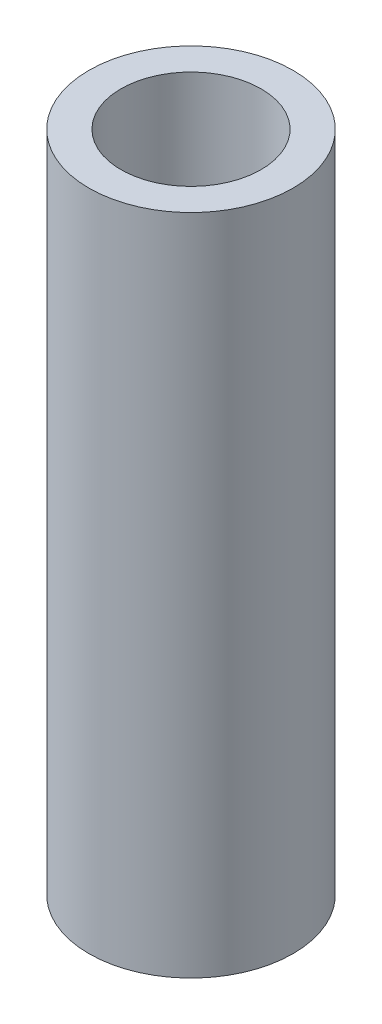
ISO-10303-21;
HEADER;
FILE_DESCRIPTION(('STEP AP214'),'2;1');
FILE_NAME('part.step','',(''),(''),'','','');
FILE_SCHEMA(('AUTOMOTIVE_DESIGN { 1 0 10303 214 1 1 1 1 }'));
ENDSEC;
DATA;
#1=APPLICATION_CONTEXT('core data for automotive mechanical design processes');
#2=APPLICATION_PROTOCOL_DEFINITION('international standard','automotive_design',2000,#1);
#3=PRODUCT_CONTEXT('',#1,'mechanical');
#4=PRODUCT('Part','Part','',(#3));
#5=PRODUCT_RELATED_PRODUCT_CATEGORY('part','',(#4));
#6=PRODUCT_DEFINITION_FORMATION('','',#4);
#7=PRODUCT_DEFINITION_CONTEXT('part definition',#1,'design');
#8=PRODUCT_DEFINITION('design','',#6,#7);
#9=PRODUCT_DEFINITION_SHAPE('','',#8);
#10=(LENGTH_UNIT() NAMED_UNIT(*) SI_UNIT(.MILLI.,.METRE.));
#11=(NAMED_UNIT(*) PLANE_ANGLE_UNIT() SI_UNIT($,.RADIAN.));
#12=(NAMED_UNIT(*) SI_UNIT($,.STERADIAN.) SOLID_ANGLE_UNIT());
#13=UNCERTAINTY_MEASURE_WITH_UNIT(LENGTH_MEASURE(1.E-05),#10,'distance_accuracy_value','');
#14=(GEOMETRIC_REPRESENTATION_CONTEXT(3) GLOBAL_UNCERTAINTY_ASSIGNED_CONTEXT((#13)) GLOBAL_UNIT_ASSIGNED_CONTEXT((#10,
#11,#12)) REPRESENTATION_CONTEXT('',''));
#15=CARTESIAN_POINT('',(0.,0.,0.));
#16=DIRECTION('',(0.,0.,1.));
#17=DIRECTION('',(1.,0.,0.));
#18=AXIS2_PLACEMENT_3D('',#15,#16,#17);
#19=CARTESIAN_POINT('',(0.,57.,0.));
#20=DIRECTION('',(0.,1.,0.));
#21=DIRECTION('',(0.,0.,1.));
#22=AXIS2_PLACEMENT_3D('',#19,#20,#21);
#23=PLANE('',#22);
#24=CARTESIAN_POINT('',(0.,57.,0.));
#25=DIRECTION('',(0.,1.,0.));
#26=DIRECTION('',(1.,0.,0.));
#27=AXIS2_PLACEMENT_3D('',#24,#25,#26);
#28=CIRCLE('',#27,8.775);
#29=CARTESIAN_POINT('',(0.,57.,-8.775));
#30=VERTEX_POINT('',#29);
#31=EDGE_CURVE('E11',#30,#30,#28,.T.);
#32=ORIENTED_EDGE('',*,*,#31,.T.);
#33=EDGE_LOOP('',(#32));
#34=FACE_BOUND('',#33,.T.);
#35=CARTESIAN_POINT('',(0.,57.,0.));
#36=DIRECTION('',(0.,1.,0.));
#37=DIRECTION('',(0.,0.,1.));
#38=AXIS2_PLACEMENT_3D('',#35,#36,#37);
#39=CIRCLE('',#38,6.025);
#40=CARTESIAN_POINT('',(0.,57.,-6.025));
#41=VERTEX_POINT('',#40);
#42=EDGE_CURVE('E62',#41,#41,#39,.T.);
#43=ORIENTED_EDGE('',*,*,#42,.F.);
#44=EDGE_LOOP('',(#43));
#45=FACE_BOUND('',#44,.T.);
#46=ADVANCED_FACE('F49',(#34,#45),#23,.T.);
#47=CARTESIAN_POINT('',(0.,0.,0.));
#48=DIRECTION('',(0.,1.,0.));
#49=DIRECTION('',(0.,0.,1.));
#50=AXIS2_PLACEMENT_3D('',#47,#48,#49);
#51=PLANE('',#50);
#52=CARTESIAN_POINT('',(0.,0.,0.));
#53=DIRECTION('',(0.,1.,0.));
#54=DIRECTION('',(1.,0.,0.));
#55=AXIS2_PLACEMENT_3D('',#52,#53,#54);
#56=CIRCLE('',#55,8.775);
#57=CARTESIAN_POINT('',(0.,0.,-8.775));
#58=VERTEX_POINT('',#57);
#59=EDGE_CURVE('E53',#58,#58,#56,.T.);
#60=ORIENTED_EDGE('',*,*,#59,.F.);
#61=EDGE_LOOP('',(#60));
#62=FACE_BOUND('',#61,.T.);
#63=CARTESIAN_POINT('',(0.,0.,0.));
#64=DIRECTION('',(0.,1.,0.));
#65=DIRECTION('',(0.,0.,1.));
#66=AXIS2_PLACEMENT_3D('',#63,#64,#65);
#67=CIRCLE('',#66,6.025);
#68=CARTESIAN_POINT('',(0.,0.,-6.025));
#69=VERTEX_POINT('',#68);
#70=EDGE_CURVE('E64',#69,#69,#67,.T.);
#71=ORIENTED_EDGE('',*,*,#70,.T.);
#72=EDGE_LOOP('',(#71));
#73=FACE_BOUND('',#72,.T.);
#74=ADVANCED_FACE('F76',(#62,#73),#51,.F.);
#75=CARTESIAN_POINT('',(0.,57.,0.));
#76=DIRECTION('',(0.,-1.,0.));
#77=DIRECTION('',(0.,0.,-1.));
#78=AXIS2_PLACEMENT_3D('',#75,#76,#77);
#79=CYLINDRICAL_SURFACE('',#78,8.775);
#80=CARTESIAN_POINT('',(0.,57.,-8.775));
#81=CARTESIAN_POINT('',(0.,56.40625,-8.775));
#82=CARTESIAN_POINT('',(0.,55.8125,-8.775));
#83=CARTESIAN_POINT('',(0.,54.625,-8.775));
#84=CARTESIAN_POINT('',(0.,54.03125,-8.775));
#85=CARTESIAN_POINT('',(0.,52.84375,-8.775));
#86=CARTESIAN_POINT('',(0.,52.25,-8.775));
#87=CARTESIAN_POINT('',(0.,51.0625,-8.775));
#88=CARTESIAN_POINT('',(0.,50.46875,-8.775));
#89=CARTESIAN_POINT('',(0.,49.28125,-8.775));
#90=CARTESIAN_POINT('',(0.,48.6875,-8.775));
#91=CARTESIAN_POINT('',(0.,47.5,-8.775));
#92=CARTESIAN_POINT('',(0.,46.90625,-8.775));
#93=CARTESIAN_POINT('',(0.,45.71875,-8.775));
#94=CARTESIAN_POINT('',(0.,45.125,-8.775));
#95=CARTESIAN_POINT('',(0.,43.9375,-8.775));
#96=CARTESIAN_POINT('',(0.,43.34375,-8.775));
#97=CARTESIAN_POINT('',(0.,42.15625,-8.775));
#98=CARTESIAN_POINT('',(0.,41.5625,-8.775));
#99=CARTESIAN_POINT('',(0.,40.375,-8.775));
#100=CARTESIAN_POINT('',(0.,39.78125,-8.775));
#101=CARTESIAN_POINT('',(0.,38.59375,-8.775));
#102=CARTESIAN_POINT('',(0.,38.,-8.775));
#103=CARTESIAN_POINT('',(0.,36.8125,-8.775));
#104=CARTESIAN_POINT('',(0.,36.21875,-8.775));
#105=CARTESIAN_POINT('',(0.,35.03125,-8.775));
#106=CARTESIAN_POINT('',(0.,34.4375,-8.775));
#107=CARTESIAN_POINT('',(0.,33.25,-8.775));
#108=CARTESIAN_POINT('',(0.,32.65625,-8.775));
#109=CARTESIAN_POINT('',(0.,31.46875,-8.775));
#110=CARTESIAN_POINT('',(0.,30.875,-8.775));
#111=CARTESIAN_POINT('',(0.,29.6875,-8.775));
#112=CARTESIAN_POINT('',(0.,29.09375,-8.775));
#113=CARTESIAN_POINT('',(0.,27.90625,-8.775));
#114=CARTESIAN_POINT('',(0.,27.3125,-8.775));
#115=CARTESIAN_POINT('',(0.,26.125,-8.775));
#116=CARTESIAN_POINT('',(0.,25.53125,-8.775));
#117=CARTESIAN_POINT('',(0.,24.34375,-8.775));
#118=CARTESIAN_POINT('',(0.,23.75,-8.775));
#119=CARTESIAN_POINT('',(0.,22.5625,-8.775));
#120=CARTESIAN_POINT('',(0.,21.96875,-8.775));
#121=CARTESIAN_POINT('',(0.,20.78125,-8.775));
#122=CARTESIAN_POINT('',(0.,20.1875,-8.775));
#123=CARTESIAN_POINT('',(0.,19.,-8.775));
#124=CARTESIAN_POINT('',(0.,18.40625,-8.775));
#125=CARTESIAN_POINT('',(0.,17.21875,-8.775));
#126=CARTESIAN_POINT('',(0.,16.625,-8.775));
#127=CARTESIAN_POINT('',(0.,15.4375,-8.775));
#128=CARTESIAN_POINT('',(0.,14.84375,-8.775));
#129=CARTESIAN_POINT('',(0.,13.65625,-8.775));
#130=CARTESIAN_POINT('',(0.,13.0625,-8.775));
#131=CARTESIAN_POINT('',(0.,11.875,-8.775));
#132=CARTESIAN_POINT('',(0.,11.28125,-8.775));
#133=CARTESIAN_POINT('',(0.,10.09375,-8.775));
#134=CARTESIAN_POINT('',(0.,9.5,-8.775));
#135=CARTESIAN_POINT('',(0.,8.3125,-8.775));
#136=CARTESIAN_POINT('',(0.,7.71875,-8.775));
#137=CARTESIAN_POINT('',(0.,6.53125,-8.775));
#138=CARTESIAN_POINT('',(0.,5.9375,-8.775));
#139=CARTESIAN_POINT('',(0.,4.75,-8.775));
#140=CARTESIAN_POINT('',(0.,4.15625,-8.775));
#141=CARTESIAN_POINT('',(0.,2.96875,-8.775));
#142=CARTESIAN_POINT('',(0.,2.375,-8.775));
#143=CARTESIAN_POINT('',(0.,1.1875,-8.775));
#144=CARTESIAN_POINT('',(0.,0.593749999999999,-8.775));
#145=CARTESIAN_POINT('',(0.,0.,-8.775));
#146=B_SPLINE_CURVE_WITH_KNOTS('',3,(#80,#81,#82,#83,#84,#85,#86,#87,#88,#89,#90,#91,#92,#93,
#94,#95,#96,#97,#98,#99,#100,#101,#102,#103,#104,#105,#106,#107,#108,#109,#110,#111,#112,#113,
#114,#115,#116,#117,#118,#119,#120,#121,#122,#123,#124,#125,#126,#127,#128,#129,#130,#131,#132,
#133,#134,#135,#136,#137,#138,#139,#140,#141,#142,#143,#144,#145),.UNSPECIFIED.,.F.,.F.,(4,2,2,
2,2,2,2,2,2,2,2,2,2,2,2,2,2,2,2,2,2,2,2,2,2,2,2,2,2,2,2,2,4),(0.,1.78125000000001,3.5625,
5.34375,7.12500000000001,8.90625,10.6875,12.46875,14.25,16.03125,17.8125,19.59375,21.375,
23.15625,24.9375,26.71875,28.5,30.28125,32.0625,33.84375,35.625,37.40625,39.1875,40.96875,42.75,
44.53125,46.3125,48.09375,49.875,51.65625,53.4375,55.21875,57.),.UNSPECIFIED.);
#147=EDGE_CURVE('BSEAM51',#30,#58,#146,.T.);
#148=ORIENTED_EDGE('',*,*,#31,.F.);
#149=ORIENTED_EDGE('',*,*,#59,.T.);
#150=ORIENTED_EDGE('',*,*,#147,.T.);
#151=ORIENTED_EDGE('',*,*,#147,.F.);
#152=EDGE_LOOP('',(#148,#150,#149,#151));
#153=FACE_BOUND('',#152,.T.);
#154=ADVANCED_FACE('F51',(#153),#79,.T.);
#155=CARTESIAN_POINT('',(0.,57.,0.));
#156=DIRECTION('',(0.,-1.,0.));
#157=DIRECTION('',(0.,0.,-1.));
#158=AXIS2_PLACEMENT_3D('',#155,#156,#157);
#159=CYLINDRICAL_SURFACE('',#158,6.025);
#160=CARTESIAN_POINT('',(0.,57.,-6.025));
#161=CARTESIAN_POINT('',(0.,56.40625,-6.025));
#162=CARTESIAN_POINT('',(0.,55.8125,-6.025));
#163=CARTESIAN_POINT('',(0.,54.625,-6.025));
#164=CARTESIAN_POINT('',(0.,54.03125,-6.025));
#165=CARTESIAN_POINT('',(0.,52.84375,-6.025));
#166=CARTESIAN_POINT('',(0.,52.25,-6.025));
#167=CARTESIAN_POINT('',(0.,51.0625,-6.025));
#168=CARTESIAN_POINT('',(0.,50.46875,-6.025));
#169=CARTESIAN_POINT('',(0.,49.28125,-6.025));
#170=CARTESIAN_POINT('',(0.,48.6875,-6.025));
#171=CARTESIAN_POINT('',(0.,47.5,-6.025));
#172=CARTESIAN_POINT('',(0.,46.90625,-6.025));
#173=CARTESIAN_POINT('',(0.,45.71875,-6.025));
#174=CARTESIAN_POINT('',(0.,45.125,-6.025));
#175=CARTESIAN_POINT('',(0.,43.9375,-6.025));
#176=CARTESIAN_POINT('',(0.,43.34375,-6.025));
#177=CARTESIAN_POINT('',(0.,42.15625,-6.025));
#178=CARTESIAN_POINT('',(0.,41.5625,-6.025));
#179=CARTESIAN_POINT('',(0.,40.375,-6.025));
#180=CARTESIAN_POINT('',(0.,39.78125,-6.025));
#181=CARTESIAN_POINT('',(0.,38.59375,-6.025));
#182=CARTESIAN_POINT('',(0.,38.,-6.025));
#183=CARTESIAN_POINT('',(0.,36.8125,-6.025));
#184=CARTESIAN_POINT('',(0.,36.21875,-6.025));
#185=CARTESIAN_POINT('',(0.,35.03125,-6.025));
#186=CARTESIAN_POINT('',(0.,34.4375,-6.025));
#187=CARTESIAN_POINT('',(0.,33.25,-6.025));
#188=CARTESIAN_POINT('',(0.,32.65625,-6.025));
#189=CARTESIAN_POINT('',(0.,31.46875,-6.025));
#190=CARTESIAN_POINT('',(0.,30.875,-6.025));
#191=CARTESIAN_POINT('',(0.,29.6875,-6.025));
#192=CARTESIAN_POINT('',(0.,29.09375,-6.025));
#193=CARTESIAN_POINT('',(0.,27.90625,-6.025));
#194=CARTESIAN_POINT('',(0.,27.3125,-6.025));
#195=CARTESIAN_POINT('',(0.,26.125,-6.025));
#196=CARTESIAN_POINT('',(0.,25.53125,-6.025));
#197=CARTESIAN_POINT('',(0.,24.34375,-6.025));
#198=CARTESIAN_POINT('',(0.,23.75,-6.025));
#199=CARTESIAN_POINT('',(0.,22.5625,-6.025));
#200=CARTESIAN_POINT('',(0.,21.96875,-6.025));
#201=CARTESIAN_POINT('',(0.,20.78125,-6.025));
#202=CARTESIAN_POINT('',(0.,20.1875,-6.025));
#203=CARTESIAN_POINT('',(0.,19.,-6.025));
#204=CARTESIAN_POINT('',(0.,18.40625,-6.025));
#205=CARTESIAN_POINT('',(0.,17.21875,-6.025));
#206=CARTESIAN_POINT('',(0.,16.625,-6.025));
#207=CARTESIAN_POINT('',(0.,15.4375,-6.025));
#208=CARTESIAN_POINT('',(0.,14.84375,-6.025));
#209=CARTESIAN_POINT('',(0.,13.65625,-6.025));
#210=CARTESIAN_POINT('',(0.,13.0625,-6.025));
#211=CARTESIAN_POINT('',(0.,11.875,-6.025));
#212=CARTESIAN_POINT('',(0.,11.28125,-6.025));
#213=CARTESIAN_POINT('',(0.,10.09375,-6.025));
#214=CARTESIAN_POINT('',(0.,9.5,-6.025));
#215=CARTESIAN_POINT('',(0.,8.3125,-6.025));
#216=CARTESIAN_POINT('',(0.,7.71875,-6.025));
#217=CARTESIAN_POINT('',(0.,6.53125,-6.025));
#218=CARTESIAN_POINT('',(0.,5.9375,-6.025));
#219=CARTESIAN_POINT('',(0.,4.75,-6.025));
#220=CARTESIAN_POINT('',(0.,4.15625,-6.025));
#221=CARTESIAN_POINT('',(0.,2.96875,-6.025));
#222=CARTESIAN_POINT('',(0.,2.375,-6.025));
#223=CARTESIAN_POINT('',(0.,1.1875,-6.025));
#224=CARTESIAN_POINT('',(0.,0.593749999999999,-6.025));
#225=CARTESIAN_POINT('',(0.,0.,-6.025));
#226=B_SPLINE_CURVE_WITH_KNOTS('',3,(#160,#161,#162,#163,#164,#165,#166,#167,#168,#169,#170,
#171,#172,#173,#174,#175,#176,#177,#178,#179,#180,#181,#182,#183,#184,#185,#186,#187,#188,#189,
#190,#191,#192,#193,#194,#195,#196,#197,#198,#199,#200,#201,#202,#203,#204,#205,#206,#207,#208,
#209,#210,#211,#212,#213,#214,#215,#216,#217,#218,#219,#220,#221,#222,#223,#224,#225),
.UNSPECIFIED.,.F.,.F.,(4,2,2,2,2,2,2,2,2,2,2,2,2,2,2,2,2,2,2,2,2,2,2,2,2,2,2,2,2,2,2,2,4),(0.,
1.78125,3.5625,5.34374999999999,7.12499999999999,8.90625,10.6875,12.46875,14.25,16.03125,
17.8125,19.59375,21.375,23.15625,24.9375,26.71875,28.5,30.28125,32.0625,33.84375,35.625,
37.40625,39.1875,40.96875,42.75,44.53125,46.3125,48.09375,49.875,51.65625,53.4375,55.21875,57.),.UNSPECIFIED.);
#227=EDGE_CURVE('BSEAM72',#41,#69,#226,.T.);
#228=ORIENTED_EDGE('',*,*,#42,.T.);
#229=ORIENTED_EDGE('',*,*,#70,.F.);
#230=ORIENTED_EDGE('',*,*,#227,.T.);
#231=ORIENTED_EDGE('',*,*,#227,.F.);
#232=EDGE_LOOP('',(#228,#230,#229,#231));
#233=FACE_BOUND('',#232,.T.);
#234=ADVANCED_FACE('F72',(#233),#159,.F.);
#235=CLOSED_SHELL('',(#46,#74,#154,#234));
#236=MANIFOLD_SOLID_BREP('B2',#235);
#237=ADVANCED_BREP_SHAPE_REPRESENTATION('',(#18,#236),#14);
#238=SHAPE_DEFINITION_REPRESENTATION(#9,#237);
ENDSEC;
END-ISO-10303-21;
